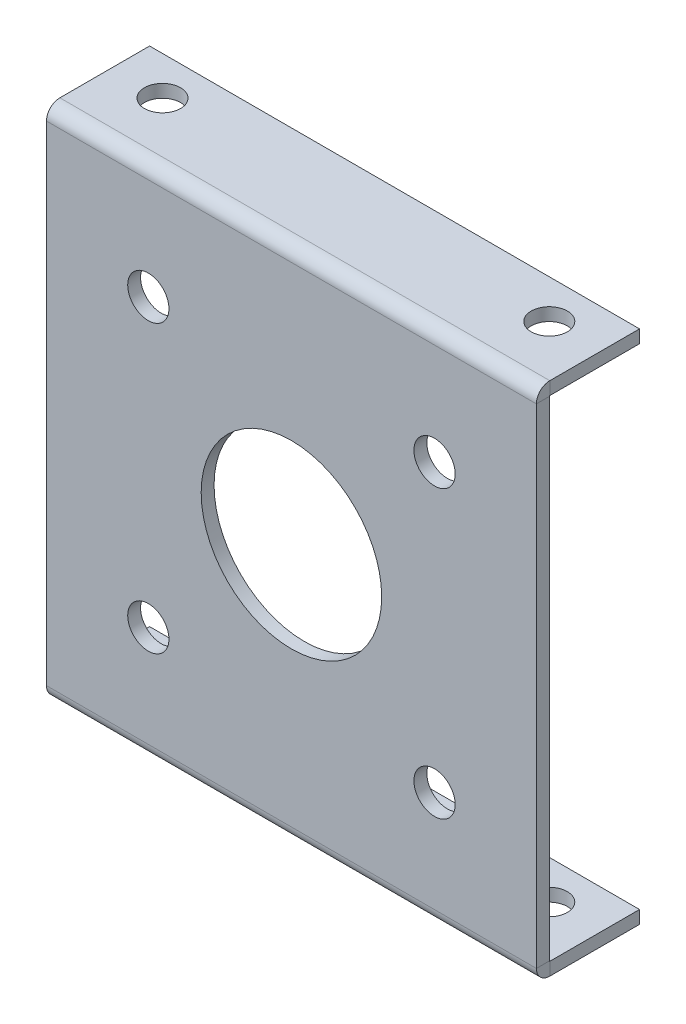
ISO-10303-21;
HEADER;
FILE_DESCRIPTION(('STEP AP214'),'2;1');
FILE_NAME('part.step','',(''),(''),'','','');
FILE_SCHEMA(('AUTOMOTIVE_DESIGN { 1 0 10303 214 1 1 1 1 }'));
ENDSEC;
DATA;
#1=APPLICATION_CONTEXT('core data for automotive mechanical design processes');
#2=APPLICATION_PROTOCOL_DEFINITION('international standard','automotive_design',2000,#1);
#3=PRODUCT_CONTEXT('',#1,'mechanical');
#4=PRODUCT('Part','Part','',(#3));
#5=PRODUCT_RELATED_PRODUCT_CATEGORY('part','',(#4));
#6=PRODUCT_DEFINITION_FORMATION('','',#4);
#7=PRODUCT_DEFINITION_CONTEXT('part definition',#1,'design');
#8=PRODUCT_DEFINITION('design','',#6,#7);
#9=PRODUCT_DEFINITION_SHAPE('','',#8);
#10=(LENGTH_UNIT() NAMED_UNIT(*) SI_UNIT(.MILLI.,.METRE.));
#11=(NAMED_UNIT(*) PLANE_ANGLE_UNIT() SI_UNIT($,.RADIAN.));
#12=(NAMED_UNIT(*) SI_UNIT($,.STERADIAN.) SOLID_ANGLE_UNIT());
#13=UNCERTAINTY_MEASURE_WITH_UNIT(LENGTH_MEASURE(1.E-05),#10,'distance_accuracy_value','');
#14=(GEOMETRIC_REPRESENTATION_CONTEXT(3) GLOBAL_UNCERTAINTY_ASSIGNED_CONTEXT((#13)) GLOBAL_UNIT_ASSIGNED_CONTEXT((#10,
#11,#12)) REPRESENTATION_CONTEXT('',''));
#15=CARTESIAN_POINT('',(0.,0.,0.));
#16=DIRECTION('',(0.,0.,1.));
#17=DIRECTION('',(1.,0.,0.));
#18=AXIS2_PLACEMENT_3D('',#15,#16,#17);
#19=CARTESIAN_POINT('',(0.,0.,-5.));
#20=DIRECTION('',(0.,0.,-1.));
#21=DIRECTION('',(-1.,0.,0.));
#22=AXIS2_PLACEMENT_3D('',#19,#20,#21);
#23=PLANE('',#22);
#24=CARTESIAN_POINT('',(55.5,-55.5,-5.));
#25=DIRECTION('',(0.,0.,-1.));
#26=DIRECTION('',(-1.,0.,0.));
#27=AXIS2_PLACEMENT_3D('',#24,#25,#26);
#28=CIRCLE('',#27,8.00000000000001);
#29=CARTESIAN_POINT('',(47.5,-55.5,-5.));
#30=VERTEX_POINT('',#29);
#31=EDGE_CURVE('E296',#30,#30,#28,.T.);
#32=ORIENTED_EDGE('',*,*,#31,.F.);
#33=EDGE_LOOP('',(#32));
#34=FACE_BOUND('',#33,.T.);
#35=CARTESIAN_POINT('',(-55.5,-55.5,-5.));
#36=DIRECTION('',(0.,0.,-1.));
#37=DIRECTION('',(-1.,0.,0.));
#38=AXIS2_PLACEMENT_3D('',#35,#36,#37);
#39=CIRCLE('',#38,8.);
#40=CARTESIAN_POINT('',(-63.5,-55.5,-5.));
#41=VERTEX_POINT('',#40);
#42=EDGE_CURVE('E309',#41,#41,#39,.T.);
#43=ORIENTED_EDGE('',*,*,#42,.F.);
#44=EDGE_LOOP('',(#43));
#45=FACE_BOUND('',#44,.T.);
#46=CARTESIAN_POINT('',(-55.5,55.5,-5.));
#47=DIRECTION('',(0.,0.,-1.));
#48=DIRECTION('',(-1.,0.,0.));
#49=AXIS2_PLACEMENT_3D('',#46,#47,#48);
#50=CIRCLE('',#49,8.);
#51=CARTESIAN_POINT('',(-63.5,55.5,-5.));
#52=VERTEX_POINT('',#51);
#53=EDGE_CURVE('E305',#52,#52,#50,.T.);
#54=ORIENTED_EDGE('',*,*,#53,.F.);
#55=EDGE_LOOP('',(#54));
#56=FACE_BOUND('',#55,.T.);
#57=CARTESIAN_POINT('',(55.5,55.5,-5.));
#58=DIRECTION('',(0.,0.,-1.));
#59=DIRECTION('',(-1.,0.,0.));
#60=AXIS2_PLACEMENT_3D('',#57,#58,#59);
#61=CIRCLE('',#60,8.00000000000001);
#62=CARTESIAN_POINT('',(47.5,55.5,-5.));
#63=VERTEX_POINT('',#62);
#64=EDGE_CURVE('E300',#63,#63,#61,.T.);
#65=ORIENTED_EDGE('',*,*,#64,.F.);
#66=EDGE_LOOP('',(#65));
#67=FACE_BOUND('',#66,.T.);
#68=CARTESIAN_POINT('',(0.,0.,-5.));
#69=DIRECTION('',(0.,0.,-1.));
#70=DIRECTION('',(-1.,0.,0.));
#71=AXIS2_PLACEMENT_3D('',#68,#69,#70);
#72=CIRCLE('',#71,35.);
#73=CARTESIAN_POINT('',(-35.,0.,-5.));
#74=VERTEX_POINT('',#73);
#75=EDGE_CURVE('E212',#74,#74,#72,.T.);
#76=ORIENTED_EDGE('',*,*,#75,.F.);
#77=EDGE_LOOP('',(#76));
#78=FACE_BOUND('',#77,.T.);
#79=DIRECTION('',(0.,1.,0.));
#80=VECTOR('',#79,1.);
#81=CARTESIAN_POINT('',(95.,-100.,-5.));
#82=LINE('',#81,#80);
#83=CARTESIAN_POINT('',(95.,-94.8,-5.00000000000001));
#84=VERTEX_POINT('',#83);
#85=CARTESIAN_POINT('',(95.,94.8,-5.));
#86=VERTEX_POINT('',#85);
#87=EDGE_CURVE('E87',#84,#86,#82,.T.);
#88=ORIENTED_EDGE('',*,*,#87,.F.);
#89=DIRECTION('',(-1.,0.,0.));
#90=VECTOR('',#89,1.);
#91=CARTESIAN_POINT('',(-95.,-94.8,-5.00000000000001));
#92=LINE('',#91,#90);
#93=CARTESIAN_POINT('',(-95.,-94.8,-5.00000000000001));
#94=VERTEX_POINT('',#93);
#95=EDGE_CURVE('E225',#94,#84,#92,.F.);
#96=ORIENTED_EDGE('',*,*,#95,.F.);
#97=DIRECTION('',(0.,-1.,0.));
#98=VECTOR('',#97,1.);
#99=CARTESIAN_POINT('',(-95.,-100.,-5.));
#100=LINE('',#99,#98);
#101=CARTESIAN_POINT('',(-95.,94.8,-5.));
#102=VERTEX_POINT('',#101);
#103=EDGE_CURVE('E13',#102,#94,#100,.T.);
#104=ORIENTED_EDGE('',*,*,#103,.F.);
#105=DIRECTION('',(1.,0.,0.));
#106=VECTOR('',#105,1.);
#107=CARTESIAN_POINT('',(95.,94.8,-5.00000000000001));
#108=LINE('',#107,#106);
#109=EDGE_CURVE('E281',#86,#102,#108,.F.);
#110=ORIENTED_EDGE('',*,*,#109,.F.);
#111=EDGE_LOOP('',(#88,#96,#104,#110));
#112=FACE_BOUND('',#111,.T.);
#113=ADVANCED_FACE('F78',(#34,#45,#56,#67,#78,#112),#23,.T.);
#114=CARTESIAN_POINT('',(0.,0.,0.));
#115=DIRECTION('',(0.,0.,-1.));
#116=DIRECTION('',(-1.,0.,0.));
#117=AXIS2_PLACEMENT_3D('',#114,#115,#116);
#118=PLANE('',#117);
#119=CARTESIAN_POINT('',(55.5,-55.5,0.));
#120=DIRECTION('',(0.,0.,-1.));
#121=DIRECTION('',(-1.,0.,0.));
#122=AXIS2_PLACEMENT_3D('',#119,#120,#121);
#123=CIRCLE('',#122,8.00000000000001);
#124=CARTESIAN_POINT('',(47.5,-55.5,0.));
#125=VERTEX_POINT('',#124);
#126=EDGE_CURVE('E310',#125,#125,#123,.T.);
#127=ORIENTED_EDGE('',*,*,#126,.T.);
#128=EDGE_LOOP('',(#127));
#129=FACE_BOUND('',#128,.T.);
#130=CARTESIAN_POINT('',(-55.5,-55.5,0.));
#131=DIRECTION('',(0.,0.,-1.));
#132=DIRECTION('',(-1.,0.,0.));
#133=AXIS2_PLACEMENT_3D('',#130,#131,#132);
#134=CIRCLE('',#133,8.);
#135=CARTESIAN_POINT('',(-63.5,-55.5,0.));
#136=VERTEX_POINT('',#135);
#137=EDGE_CURVE('E306',#136,#136,#134,.T.);
#138=ORIENTED_EDGE('',*,*,#137,.T.);
#139=EDGE_LOOP('',(#138));
#140=FACE_BOUND('',#139,.T.);
#141=CARTESIAN_POINT('',(-55.5,55.5,0.));
#142=DIRECTION('',(0.,0.,-1.));
#143=DIRECTION('',(-1.,0.,0.));
#144=AXIS2_PLACEMENT_3D('',#141,#142,#143);
#145=CIRCLE('',#144,8.);
#146=CARTESIAN_POINT('',(-63.5,55.5,0.));
#147=VERTEX_POINT('',#146);
#148=EDGE_CURVE('E302',#147,#147,#145,.T.);
#149=ORIENTED_EDGE('',*,*,#148,.T.);
#150=EDGE_LOOP('',(#149));
#151=FACE_BOUND('',#150,.T.);
#152=CARTESIAN_POINT('',(55.5,55.5,0.));
#153=DIRECTION('',(0.,0.,-1.));
#154=DIRECTION('',(-1.,0.,0.));
#155=AXIS2_PLACEMENT_3D('',#152,#153,#154);
#156=CIRCLE('',#155,8.00000000000001);
#157=CARTESIAN_POINT('',(47.5,55.5,0.));
#158=VERTEX_POINT('',#157);
#159=EDGE_CURVE('E297',#158,#158,#156,.T.);
#160=ORIENTED_EDGE('',*,*,#159,.T.);
#161=EDGE_LOOP('',(#160));
#162=FACE_BOUND('',#161,.T.);
#163=CARTESIAN_POINT('',(0.,0.,0.));
#164=DIRECTION('',(0.,0.,-1.));
#165=DIRECTION('',(-1.,0.,0.));
#166=AXIS2_PLACEMENT_3D('',#163,#164,#165);
#167=CIRCLE('',#166,35.);
#168=CARTESIAN_POINT('',(-35.,0.,0.));
#169=VERTEX_POINT('',#168);
#170=EDGE_CURVE('E293',#169,#169,#167,.T.);
#171=ORIENTED_EDGE('',*,*,#170,.T.);
#172=EDGE_LOOP('',(#171));
#173=FACE_BOUND('',#172,.T.);
#174=DIRECTION('',(-1.,0.,0.));
#175=VECTOR('',#174,1.);
#176=CARTESIAN_POINT('',(-95.,-94.8,0.));
#177=LINE('',#176,#175);
#178=CARTESIAN_POINT('',(-95.,-94.8,0.));
#179=VERTEX_POINT('',#178);
#180=CARTESIAN_POINT('',(95.,-94.8,0.));
#181=VERTEX_POINT('',#180);
#182=EDGE_CURVE('E213',#179,#181,#177,.F.);
#183=ORIENTED_EDGE('',*,*,#182,.T.);
#184=DIRECTION('',(0.,1.,0.));
#185=VECTOR('',#184,1.);
#186=CARTESIAN_POINT('',(95.,-100.,0.));
#187=LINE('',#186,#185);
#188=CARTESIAN_POINT('',(95.,94.8,0.));
#189=VERTEX_POINT('',#188);
#190=EDGE_CURVE('E287',#181,#189,#187,.T.);
#191=ORIENTED_EDGE('',*,*,#190,.T.);
#192=DIRECTION('',(1.,0.,0.));
#193=VECTOR('',#192,1.);
#194=CARTESIAN_POINT('',(95.,94.8,0.));
#195=LINE('',#194,#193);
#196=CARTESIAN_POINT('',(-95.,94.8,0.));
#197=VERTEX_POINT('',#196);
#198=EDGE_CURVE('E269',#189,#197,#195,.F.);
#199=ORIENTED_EDGE('',*,*,#198,.T.);
#200=DIRECTION('',(0.,-1.,0.));
#201=VECTOR('',#200,1.);
#202=CARTESIAN_POINT('',(-95.,-100.,0.));
#203=LINE('',#202,#201);
#204=EDGE_CURVE('E289',#197,#179,#203,.T.);
#205=ORIENTED_EDGE('',*,*,#204,.T.);
#206=EDGE_LOOP('',(#183,#191,#199,#205));
#207=FACE_BOUND('',#206,.T.);
#208=ADVANCED_FACE('F371',(#129,#140,#151,#162,#173,#207),#118,.F.);
#209=CARTESIAN_POINT('',(-95.,-100.,-5.));
#210=DIRECTION('',(-1.,0.,0.));
#211=DIRECTION('',(0.,0.,1.));
#212=AXIS2_PLACEMENT_3D('',#209,#210,#211);
#213=PLANE('',#212);
#214=ORIENTED_EDGE('',*,*,#103,.T.);
#215=DIRECTION('',(0.,0.,1.));
#216=VECTOR('',#215,1.);
#217=CARTESIAN_POINT('',(-95.,-94.8,-5.00000000000001));
#218=LINE('',#217,#216);
#219=EDGE_CURVE('E219',#94,#179,#218,.T.);
#220=ORIENTED_EDGE('',*,*,#219,.T.);
#221=ORIENTED_EDGE('',*,*,#204,.F.);
#222=DIRECTION('',(0.,0.,1.));
#223=VECTOR('',#222,1.);
#224=CARTESIAN_POINT('',(-95.,94.8,-5.00000000000001));
#225=LINE('',#224,#223);
#226=EDGE_CURVE('E94',#102,#197,#225,.T.);
#227=ORIENTED_EDGE('',*,*,#226,.F.);
#228=EDGE_LOOP('',(#214,#220,#221,#227));
#229=FACE_BOUND('',#228,.T.);
#230=ADVANCED_FACE('F377',(#229),#213,.T.);
#231=CARTESIAN_POINT('',(95.,-100.,-5.));
#232=DIRECTION('',(1.,0.,0.));
#233=DIRECTION('',(0.,0.,-1.));
#234=AXIS2_PLACEMENT_3D('',#231,#232,#233);
#235=PLANE('',#234);
#236=DIRECTION('',(0.,0.,1.));
#237=VECTOR('',#236,1.);
#238=CARTESIAN_POINT('',(95.,-94.8,-5.00000000000001));
#239=LINE('',#238,#237);
#240=EDGE_CURVE('E231',#84,#181,#239,.T.);
#241=ORIENTED_EDGE('',*,*,#240,.F.);
#242=ORIENTED_EDGE('',*,*,#87,.T.);
#243=DIRECTION('',(0.,0.,1.));
#244=VECTOR('',#243,1.);
#245=CARTESIAN_POINT('',(95.,94.8,-5.00000000000001));
#246=LINE('',#245,#244);
#247=EDGE_CURVE('E275',#86,#189,#246,.T.);
#248=ORIENTED_EDGE('',*,*,#247,.T.);
#249=ORIENTED_EDGE('',*,*,#190,.F.);
#250=EDGE_LOOP('',(#241,#242,#248,#249));
#251=FACE_BOUND('',#250,.T.);
#252=ADVANCED_FACE('F80',(#251),#235,.T.);
#253=CARTESIAN_POINT('',(-95.,94.8,-5.20000000000001));
#254=DIRECTION('',(-1.,0.,0.));
#255=DIRECTION('',(0.,0.,1.));
#256=AXIS2_PLACEMENT_3D('',#253,#254,#255);
#257=PLANE('',#256);
#258=DIRECTION('',(0.,1.,0.));
#259=VECTOR('',#258,1.);
#260=CARTESIAN_POINT('',(-95.,100.,-5.19999999999999));
#261=LINE('',#260,#259);
#262=CARTESIAN_POINT('',(-95.,95.,-5.20000000000001));
#263=VERTEX_POINT('',#262);
#264=CARTESIAN_POINT('',(-95.,100.,-5.19999999999999));
#265=VERTEX_POINT('',#264);
#266=EDGE_CURVE('E234',#263,#265,#261,.T.);
#267=ORIENTED_EDGE('',*,*,#266,.F.);
#268=CARTESIAN_POINT('',(-95.,94.8,-5.20000000000001));
#269=DIRECTION('',(1.,0.,0.));
#270=DIRECTION('',(0.,0.,-1.));
#271=AXIS2_PLACEMENT_3D('',#268,#269,#270);
#272=CIRCLE('',#271,0.200000000000006);
#273=EDGE_CURVE('E278',#102,#263,#272,.F.);
#274=ORIENTED_EDGE('',*,*,#273,.F.);
#275=ORIENTED_EDGE('',*,*,#226,.T.);
#276=CARTESIAN_POINT('',(-95.,94.8,-5.20000000000001));
#277=DIRECTION('',(1.,0.,0.));
#278=DIRECTION('',(0.,0.,-1.));
#279=AXIS2_PLACEMENT_3D('',#276,#277,#278);
#280=CIRCLE('',#279,5.20000000000001);
#281=EDGE_CURVE('E271',#197,#265,#280,.F.);
#282=ORIENTED_EDGE('',*,*,#281,.T.);
#283=EDGE_LOOP('',(#267,#274,#275,#282));
#284=FACE_BOUND('',#283,.T.);
#285=ADVANCED_FACE('F389',(#284),#257,.T.);
#286=CARTESIAN_POINT('',(95.,94.8,-5.20000000000001));
#287=DIRECTION('',(-1.,0.,0.));
#288=DIRECTION('',(0.,0.,1.));
#289=AXIS2_PLACEMENT_3D('',#286,#287,#288);
#290=PLANE('',#289);
#291=CARTESIAN_POINT('',(95.,94.8,-5.20000000000001));
#292=DIRECTION('',(1.,0.,0.));
#293=DIRECTION('',(0.,0.,-1.));
#294=AXIS2_PLACEMENT_3D('',#291,#292,#293);
#295=CIRCLE('',#294,0.200000000000006);
#296=CARTESIAN_POINT('',(95.,95.,-5.20000000000001));
#297=VERTEX_POINT('',#296);
#298=EDGE_CURVE('E239',#297,#86,#295,.T.);
#299=ORIENTED_EDGE('',*,*,#298,.F.);
#300=DIRECTION('',(0.,1.,0.));
#301=VECTOR('',#300,1.);
#302=CARTESIAN_POINT('',(95.,95.,-5.20000000000001));
#303=LINE('',#302,#301);
#304=CARTESIAN_POINT('',(95.,100.,-5.19999999999999));
#305=VERTEX_POINT('',#304);
#306=EDGE_CURVE('E262',#297,#305,#303,.T.);
#307=ORIENTED_EDGE('',*,*,#306,.T.);
#308=CARTESIAN_POINT('',(95.,94.8,-5.20000000000001));
#309=DIRECTION('',(1.,0.,0.));
#310=DIRECTION('',(0.,0.,-1.));
#311=AXIS2_PLACEMENT_3D('',#308,#309,#310);
#312=CIRCLE('',#311,5.20000000000001);
#313=EDGE_CURVE('E272',#305,#189,#312,.T.);
#314=ORIENTED_EDGE('',*,*,#313,.T.);
#315=ORIENTED_EDGE('',*,*,#247,.F.);
#316=EDGE_LOOP('',(#299,#307,#314,#315));
#317=FACE_BOUND('',#316,.T.);
#318=ADVANCED_FACE('F383',(#317),#290,.F.);
#319=CARTESIAN_POINT('',(95.,94.8,-5.20000000000001));
#320=DIRECTION('',(1.,0.,0.));
#321=DIRECTION('',(0.,1.,0.));
#322=AXIS2_PLACEMENT_3D('',#319,#320,#321);
#323=CYLINDRICAL_SURFACE('',#322,5.20000000000001);
#324=ORIENTED_EDGE('',*,*,#198,.F.);
#325=ORIENTED_EDGE('',*,*,#313,.F.);
#326=DIRECTION('',(1.,0.,0.));
#327=VECTOR('',#326,1.);
#328=CARTESIAN_POINT('',(0.,100.,-5.19999999999999));
#329=LINE('',#328,#327);
#330=EDGE_CURVE('E259',#265,#305,#329,.T.);
#331=ORIENTED_EDGE('',*,*,#330,.F.);
#332=ORIENTED_EDGE('',*,*,#281,.F.);
#333=EDGE_LOOP('',(#324,#325,#331,#332));
#334=FACE_BOUND('',#333,.T.);
#335=ADVANCED_FACE('F422',(#334),#323,.T.);
#336=CARTESIAN_POINT('',(95.,94.8,-5.20000000000001));
#337=DIRECTION('',(1.,0.,0.));
#338=DIRECTION('',(0.,1.,0.));
#339=AXIS2_PLACEMENT_3D('',#336,#337,#338);
#340=CYLINDRICAL_SURFACE('',#339,0.200000000000006);
#341=ORIENTED_EDGE('',*,*,#109,.T.);
#342=ORIENTED_EDGE('',*,*,#273,.T.);
#343=DIRECTION('',(-1.,0.,0.));
#344=VECTOR('',#343,1.);
#345=CARTESIAN_POINT('',(-95.,95.,-5.20000000000001));
#346=LINE('',#345,#344);
#347=EDGE_CURVE('E265',#263,#297,#346,.F.);
#348=ORIENTED_EDGE('',*,*,#347,.T.);
#349=ORIENTED_EDGE('',*,*,#298,.T.);
#350=EDGE_LOOP('',(#341,#342,#348,#349));
#351=FACE_BOUND('',#350,.T.);
#352=ADVANCED_FACE('F395',(#351),#340,.F.);
#353=CARTESIAN_POINT('',(95.,100.,-4.99999999999998));
#354=DIRECTION('',(1.,0.,0.));
#355=DIRECTION('',(0.,0.,-1.));
#356=AXIS2_PLACEMENT_3D('',#353,#354,#355);
#357=PLANE('',#356);
#358=DIRECTION('',(0.,0.,1.));
#359=VECTOR('',#358,1.);
#360=CARTESIAN_POINT('',(95.,100.,-4.99999999999998));
#361=LINE('',#360,#359);
#362=CARTESIAN_POINT('',(95.,100.,-40.));
#363=VERTEX_POINT('',#362);
#364=EDGE_CURVE('E243',#363,#305,#361,.T.);
#365=ORIENTED_EDGE('',*,*,#364,.T.);
#366=ORIENTED_EDGE('',*,*,#306,.F.);
#367=DIRECTION('',(0.,0.,-1.));
#368=VECTOR('',#367,1.);
#369=CARTESIAN_POINT('',(95.,95.,3.56857400772372E-13));
#370=LINE('',#369,#368);
#371=CARTESIAN_POINT('',(95.,95.0000000000001,-40.));
#372=VERTEX_POINT('',#371);
#373=EDGE_CURVE('E251',#372,#297,#370,.F.);
#374=ORIENTED_EDGE('',*,*,#373,.F.);
#375=DIRECTION('',(0.,-1.,0.));
#376=VECTOR('',#375,1.);
#377=CARTESIAN_POINT('',(95.,100.,-40.));
#378=LINE('',#377,#376);
#379=EDGE_CURVE('E237',#363,#372,#378,.T.);
#380=ORIENTED_EDGE('',*,*,#379,.F.);
#381=EDGE_LOOP('',(#365,#366,#374,#380));
#382=FACE_BOUND('',#381,.T.);
#383=ADVANCED_FACE('F417',(#382),#357,.T.);
#384=CARTESIAN_POINT('',(-95.,100.,-40.));
#385=DIRECTION('',(-1.,0.,0.));
#386=DIRECTION('',(0.,0.,1.));
#387=AXIS2_PLACEMENT_3D('',#384,#385,#386);
#388=PLANE('',#387);
#389=DIRECTION('',(0.,0.,1.));
#390=VECTOR('',#389,1.);
#391=CARTESIAN_POINT('',(-95.,95.,3.56857400772372E-13));
#392=LINE('',#391,#390);
#393=CARTESIAN_POINT('',(-95.,95.0000000000001,-40.));
#394=VERTEX_POINT('',#393);
#395=EDGE_CURVE('E257',#263,#394,#392,.F.);
#396=ORIENTED_EDGE('',*,*,#395,.F.);
#397=ORIENTED_EDGE('',*,*,#266,.T.);
#398=DIRECTION('',(0.,0.,-1.));
#399=VECTOR('',#398,1.);
#400=CARTESIAN_POINT('',(-95.,100.,-40.));
#401=LINE('',#400,#399);
#402=CARTESIAN_POINT('',(-95.,100.,-40.));
#403=VERTEX_POINT('',#402);
#404=EDGE_CURVE('E249',#265,#403,#401,.T.);
#405=ORIENTED_EDGE('',*,*,#404,.T.);
#406=DIRECTION('',(0.,-1.,0.));
#407=VECTOR('',#406,1.);
#408=CARTESIAN_POINT('',(-95.,100.,-40.));
#409=LINE('',#408,#407);
#410=EDGE_CURVE('E240',#403,#394,#409,.T.);
#411=ORIENTED_EDGE('',*,*,#410,.T.);
#412=EDGE_LOOP('',(#396,#397,#405,#411));
#413=FACE_BOUND('',#412,.T.);
#414=ADVANCED_FACE('F403',(#413),#388,.T.);
#415=CARTESIAN_POINT('',(0.,100.,3.74314807466587E-13));
#416=DIRECTION('',(0.,1.,0.));
#417=DIRECTION('',(0.,0.,1.));
#418=AXIS2_PLACEMENT_3D('',#415,#416,#417);
#419=PLANE('',#418);
#420=CARTESIAN_POINT('',(-75.,100.,-25.0000000000007));
#421=DIRECTION('',(0.,-1.,0.));
#422=DIRECTION('',(0.,0.,-1.));
#423=AXIS2_PLACEMENT_3D('',#420,#421,#422);
#424=CIRCLE('',#423,7.);
#425=CARTESIAN_POINT('',(-75.,100.,-32.0000000000007));
#426=VERTEX_POINT('',#425);
#427=EDGE_CURVE('E315',#426,#426,#424,.T.);
#428=ORIENTED_EDGE('',*,*,#427,.T.);
#429=EDGE_LOOP('',(#428));
#430=FACE_BOUND('',#429,.T.);
#431=CARTESIAN_POINT('',(75.,100.,-25.0000000000007));
#432=DIRECTION('',(0.,-1.,0.));
#433=DIRECTION('',(0.,0.,-1.));
#434=AXIS2_PLACEMENT_3D('',#431,#432,#433);
#435=CIRCLE('',#434,7.);
#436=CARTESIAN_POINT('',(75.,100.,-32.0000000000007));
#437=VERTEX_POINT('',#436);
#438=EDGE_CURVE('E322',#437,#437,#435,.T.);
#439=ORIENTED_EDGE('',*,*,#438,.T.);
#440=EDGE_LOOP('',(#439));
#441=FACE_BOUND('',#440,.T.);
#442=ORIENTED_EDGE('',*,*,#404,.F.);
#443=ORIENTED_EDGE('',*,*,#330,.T.);
#444=ORIENTED_EDGE('',*,*,#364,.F.);
#445=DIRECTION('',(1.,0.,0.));
#446=VECTOR('',#445,1.);
#447=CARTESIAN_POINT('',(95.,100.,-40.));
#448=LINE('',#447,#446);
#449=EDGE_CURVE('E246',#403,#363,#448,.T.);
#450=ORIENTED_EDGE('',*,*,#449,.F.);
#451=EDGE_LOOP('',(#442,#443,#444,#450));
#452=FACE_BOUND('',#451,.T.);
#453=ADVANCED_FACE('F407',(#430,#441,#452),#419,.T.);
#454=CARTESIAN_POINT('',(0.,95.,3.56857400772372E-13));
#455=DIRECTION('',(0.,1.,0.));
#456=DIRECTION('',(0.,0.,1.));
#457=AXIS2_PLACEMENT_3D('',#454,#455,#456);
#458=PLANE('',#457);
#459=CARTESIAN_POINT('',(-75.,95.0000000000001,-25.0000000000007));
#460=DIRECTION('',(0.,1.,0.));
#461=DIRECTION('',(0.,0.,1.));
#462=AXIS2_PLACEMENT_3D('',#459,#460,#461);
#463=CIRCLE('',#462,7.);
#464=CARTESIAN_POINT('',(-75.,95.,-18.0000000000007));
#465=VERTEX_POINT('',#464);
#466=EDGE_CURVE('E301',#465,#465,#463,.T.);
#467=ORIENTED_EDGE('',*,*,#466,.T.);
#468=EDGE_LOOP('',(#467));
#469=FACE_BOUND('',#468,.T.);
#470=CARTESIAN_POINT('',(75.,95.0000000000001,-25.0000000000007));
#471=DIRECTION('',(0.,1.,0.));
#472=DIRECTION('',(0.,0.,1.));
#473=AXIS2_PLACEMENT_3D('',#470,#471,#472);
#474=CIRCLE('',#473,7.);
#475=CARTESIAN_POINT('',(75.,95.,-18.0000000000007));
#476=VERTEX_POINT('',#475);
#477=EDGE_CURVE('E319',#476,#476,#474,.T.);
#478=ORIENTED_EDGE('',*,*,#477,.T.);
#479=EDGE_LOOP('',(#478));
#480=FACE_BOUND('',#479,.T.);
#481=ORIENTED_EDGE('',*,*,#347,.F.);
#482=ORIENTED_EDGE('',*,*,#395,.T.);
#483=DIRECTION('',(-1.,0.,0.));
#484=VECTOR('',#483,1.);
#485=CARTESIAN_POINT('',(0.,95.0000000000001,-40.));
#486=LINE('',#485,#484);
#487=EDGE_CURVE('E254',#394,#372,#486,.F.);
#488=ORIENTED_EDGE('',*,*,#487,.T.);
#489=ORIENTED_EDGE('',*,*,#373,.T.);
#490=EDGE_LOOP('',(#481,#482,#488,#489));
#491=FACE_BOUND('',#490,.T.);
#492=ADVANCED_FACE('F414',(#469,#480,#491),#458,.F.);
#493=CARTESIAN_POINT('',(95.,100.,-40.));
#494=DIRECTION('',(0.,0.,-1.));
#495=DIRECTION('',(0.,1.,0.));
#496=AXIS2_PLACEMENT_3D('',#493,#494,#495);
#497=PLANE('',#496);
#498=ORIENTED_EDGE('',*,*,#487,.F.);
#499=ORIENTED_EDGE('',*,*,#410,.F.);
#500=ORIENTED_EDGE('',*,*,#449,.T.);
#501=ORIENTED_EDGE('',*,*,#379,.T.);
#502=EDGE_LOOP('',(#498,#499,#500,#501));
#503=FACE_BOUND('',#502,.T.);
#504=ADVANCED_FACE('F411',(#503),#497,.T.);
#505=CARTESIAN_POINT('',(95.,-94.8,-5.20000000000001));
#506=DIRECTION('',(1.,0.,0.));
#507=DIRECTION('',(0.,0.,-1.));
#508=AXIS2_PLACEMENT_3D('',#505,#506,#507);
#509=PLANE('',#508);
#510=DIRECTION('',(0.,1.,0.));
#511=VECTOR('',#510,1.);
#512=CARTESIAN_POINT('',(95.,-100.,-5.19999999999999));
#513=LINE('',#512,#511);
#514=CARTESIAN_POINT('',(95.,-95.,-5.20000000000001));
#515=VERTEX_POINT('',#514);
#516=CARTESIAN_POINT('',(95.,-100.,-5.19999999999999));
#517=VERTEX_POINT('',#516);
#518=EDGE_CURVE('E194',#515,#517,#513,.F.);
#519=ORIENTED_EDGE('',*,*,#518,.F.);
#520=CARTESIAN_POINT('',(95.,-94.8,-5.20000000000001));
#521=DIRECTION('',(-1.,0.,0.));
#522=DIRECTION('',(0.,0.,1.));
#523=AXIS2_PLACEMENT_3D('',#520,#521,#522);
#524=CIRCLE('',#523,0.200000000000006);
#525=EDGE_CURVE('E222',#84,#515,#524,.F.);
#526=ORIENTED_EDGE('',*,*,#525,.F.);
#527=ORIENTED_EDGE('',*,*,#240,.T.);
#528=CARTESIAN_POINT('',(95.,-94.8,-5.20000000000001));
#529=DIRECTION('',(-1.,0.,0.));
#530=DIRECTION('',(0.,0.,1.));
#531=AXIS2_PLACEMENT_3D('',#528,#529,#530);
#532=CIRCLE('',#531,5.20000000000001);
#533=EDGE_CURVE('E215',#181,#517,#532,.F.);
#534=ORIENTED_EDGE('',*,*,#533,.T.);
#535=EDGE_LOOP('',(#519,#526,#527,#534));
#536=FACE_BOUND('',#535,.T.);
#537=ADVANCED_FACE('F427',(#536),#509,.T.);
#538=CARTESIAN_POINT('',(-95.,-94.8,-5.20000000000001));
#539=DIRECTION('',(1.,0.,0.));
#540=DIRECTION('',(0.,0.,-1.));
#541=AXIS2_PLACEMENT_3D('',#538,#539,#540);
#542=PLANE('',#541);
#543=CARTESIAN_POINT('',(-95.,-94.8,-5.20000000000001));
#544=DIRECTION('',(-1.,0.,0.));
#545=DIRECTION('',(0.,0.,1.));
#546=AXIS2_PLACEMENT_3D('',#543,#544,#545);
#547=CIRCLE('',#546,0.200000000000006);
#548=CARTESIAN_POINT('',(-95.,-95.,-5.20000000000001));
#549=VERTEX_POINT('',#548);
#550=EDGE_CURVE('E228',#549,#94,#547,.T.);
#551=ORIENTED_EDGE('',*,*,#550,.F.);
#552=DIRECTION('',(0.,1.,0.));
#553=VECTOR('',#552,1.);
#554=CARTESIAN_POINT('',(-95.,-95.,-5.20000000000001));
#555=LINE('',#554,#553);
#556=CARTESIAN_POINT('',(-95.,-100.,-5.19999999999999));
#557=VERTEX_POINT('',#556);
#558=EDGE_CURVE('E206',#549,#557,#555,.F.);
#559=ORIENTED_EDGE('',*,*,#558,.T.);
#560=CARTESIAN_POINT('',(-95.,-94.8,-5.20000000000001));
#561=DIRECTION('',(-1.,0.,0.));
#562=DIRECTION('',(0.,0.,1.));
#563=AXIS2_PLACEMENT_3D('',#560,#561,#562);
#564=CIRCLE('',#563,5.20000000000001);
#565=EDGE_CURVE('E216',#557,#179,#564,.T.);
#566=ORIENTED_EDGE('',*,*,#565,.T.);
#567=ORIENTED_EDGE('',*,*,#219,.F.);
#568=EDGE_LOOP('',(#551,#559,#566,#567));
#569=FACE_BOUND('',#568,.T.);
#570=ADVANCED_FACE('F357',(#569),#542,.F.);
#571=CARTESIAN_POINT('',(-95.,-94.8,-5.20000000000001));
#572=DIRECTION('',(-1.,0.,0.));
#573=DIRECTION('',(0.,-1.,0.));
#574=AXIS2_PLACEMENT_3D('',#571,#572,#573);
#575=CYLINDRICAL_SURFACE('',#574,5.20000000000001);
#576=ORIENTED_EDGE('',*,*,#182,.F.);
#577=ORIENTED_EDGE('',*,*,#565,.F.);
#578=DIRECTION('',(-1.,0.,0.));
#579=VECTOR('',#578,1.);
#580=CARTESIAN_POINT('',(95.,-100.,-5.19999999999999));
#581=LINE('',#580,#579);
#582=EDGE_CURVE('E204',#557,#517,#581,.F.);
#583=ORIENTED_EDGE('',*,*,#582,.T.);
#584=ORIENTED_EDGE('',*,*,#533,.F.);
#585=EDGE_LOOP('',(#576,#577,#583,#584));
#586=FACE_BOUND('',#585,.T.);
#587=ADVANCED_FACE('F366',(#586),#575,.T.);
#588=CARTESIAN_POINT('',(-95.,-94.8,-5.20000000000001));
#589=DIRECTION('',(-1.,0.,0.));
#590=DIRECTION('',(0.,-1.,0.));
#591=AXIS2_PLACEMENT_3D('',#588,#589,#590);
#592=CYLINDRICAL_SURFACE('',#591,0.200000000000006);
#593=ORIENTED_EDGE('',*,*,#95,.T.);
#594=ORIENTED_EDGE('',*,*,#525,.T.);
#595=DIRECTION('',(-1.,0.,0.));
#596=VECTOR('',#595,1.);
#597=CARTESIAN_POINT('',(95.,-95.,-5.20000000000001));
#598=LINE('',#597,#596);
#599=EDGE_CURVE('E209',#515,#549,#598,.T.);
#600=ORIENTED_EDGE('',*,*,#599,.T.);
#601=ORIENTED_EDGE('',*,*,#550,.T.);
#602=EDGE_LOOP('',(#593,#594,#600,#601));
#603=FACE_BOUND('',#602,.T.);
#604=ADVANCED_FACE('F352',(#603),#592,.F.);
#605=CARTESIAN_POINT('',(-95.,-100.,-40.));
#606=DIRECTION('',(1.,0.,0.));
#607=DIRECTION('',(0.,0.,-1.));
#608=AXIS2_PLACEMENT_3D('',#605,#606,#607);
#609=PLANE('',#608);
#610=ORIENTED_EDGE('',*,*,#558,.F.);
#611=DIRECTION('',(0.,0.,1.));
#612=VECTOR('',#611,1.);
#613=CARTESIAN_POINT('',(-95.,-95.0000000000001,-40.));
#614=LINE('',#613,#612);
#615=CARTESIAN_POINT('',(-95.,-95.0000000000001,-40.));
#616=VERTEX_POINT('',#615);
#617=EDGE_CURVE('E202',#549,#616,#614,.F.);
#618=ORIENTED_EDGE('',*,*,#617,.T.);
#619=DIRECTION('',(0.,1.,0.));
#620=VECTOR('',#619,1.);
#621=CARTESIAN_POINT('',(-95.,-100.,-40.));
#622=LINE('',#621,#620);
#623=CARTESIAN_POINT('',(-95.,-100.,-40.));
#624=VERTEX_POINT('',#623);
#625=EDGE_CURVE('E190',#624,#616,#622,.T.);
#626=ORIENTED_EDGE('',*,*,#625,.F.);
#627=DIRECTION('',(0.,0.,-1.));
#628=VECTOR('',#627,1.);
#629=CARTESIAN_POINT('',(-95.,-100.,3.74314807466587E-13));
#630=LINE('',#629,#628);
#631=EDGE_CURVE('E177',#557,#624,#630,.T.);
#632=ORIENTED_EDGE('',*,*,#631,.F.);
#633=EDGE_LOOP('',(#610,#618,#626,#632));
#634=FACE_BOUND('',#633,.T.);
#635=ADVANCED_FACE('F358',(#634),#609,.F.);
#636=CARTESIAN_POINT('',(95.,-100.,-4.99999999999998));
#637=DIRECTION('',(-1.,0.,0.));
#638=DIRECTION('',(0.,0.,1.));
#639=AXIS2_PLACEMENT_3D('',#636,#637,#638);
#640=PLANE('',#639);
#641=ORIENTED_EDGE('',*,*,#518,.T.);
#642=DIRECTION('',(0.,0.,1.));
#643=VECTOR('',#642,1.);
#644=CARTESIAN_POINT('',(95.,-100.,3.74314807466587E-13));
#645=LINE('',#644,#643);
#646=CARTESIAN_POINT('',(95.,-100.,-40.));
#647=VERTEX_POINT('',#646);
#648=EDGE_CURVE('E175',#647,#517,#645,.T.);
#649=ORIENTED_EDGE('',*,*,#648,.F.);
#650=DIRECTION('',(0.,1.,0.));
#651=VECTOR('',#650,1.);
#652=CARTESIAN_POINT('',(95.,-100.,-40.));
#653=LINE('',#652,#651);
#654=CARTESIAN_POINT('',(95.,-95.0000000000001,-40.));
#655=VERTEX_POINT('',#654);
#656=EDGE_CURVE('E183',#647,#655,#653,.T.);
#657=ORIENTED_EDGE('',*,*,#656,.T.);
#658=DIRECTION('',(0.,0.,-1.));
#659=VECTOR('',#658,1.);
#660=CARTESIAN_POINT('',(95.,-95.,-5.));
#661=LINE('',#660,#659);
#662=EDGE_CURVE('E199',#655,#515,#661,.F.);
#663=ORIENTED_EDGE('',*,*,#662,.T.);
#664=EDGE_LOOP('',(#641,#649,#657,#663));
#665=FACE_BOUND('',#664,.T.);
#666=ADVANCED_FACE('F193',(#665),#640,.F.);
#667=CARTESIAN_POINT('',(0.,-100.,3.74314807466587E-13));
#668=DIRECTION('',(0.,1.,0.));
#669=DIRECTION('',(0.,0.,1.));
#670=AXIS2_PLACEMENT_3D('',#667,#668,#669);
#671=PLANE('',#670);
#672=CARTESIAN_POINT('',(-75.,-100.,-25.));
#673=DIRECTION('',(0.,1.,0.));
#674=DIRECTION('',(0.,0.,1.));
#675=AXIS2_PLACEMENT_3D('',#672,#673,#674);
#676=CIRCLE('',#675,7.);
#677=CARTESIAN_POINT('',(-75.,-100.,-18.));
#678=VERTEX_POINT('',#677);
#679=EDGE_CURVE('E331',#678,#678,#676,.T.);
#680=ORIENTED_EDGE('',*,*,#679,.T.);
#681=EDGE_LOOP('',(#680));
#682=FACE_BOUND('',#681,.T.);
#683=CARTESIAN_POINT('',(75.,-100.,-25.));
#684=DIRECTION('',(0.,1.,0.));
#685=DIRECTION('',(0.,0.,1.));
#686=AXIS2_PLACEMENT_3D('',#683,#684,#685);
#687=CIRCLE('',#686,7.);
#688=CARTESIAN_POINT('',(75.,-100.,-18.));
#689=VERTEX_POINT('',#688);
#690=EDGE_CURVE('E314',#689,#689,#687,.T.);
#691=ORIENTED_EDGE('',*,*,#690,.T.);
#692=EDGE_LOOP('',(#691));
#693=FACE_BOUND('',#692,.T.);
#694=ORIENTED_EDGE('',*,*,#582,.F.);
#695=ORIENTED_EDGE('',*,*,#631,.T.);
#696=DIRECTION('',(1.,0.,0.));
#697=VECTOR('',#696,1.);
#698=CARTESIAN_POINT('',(0.,-100.,-40.));
#699=LINE('',#698,#697);
#700=EDGE_CURVE('E170',#624,#647,#699,.T.);
#701=ORIENTED_EDGE('',*,*,#700,.T.);
#702=ORIENTED_EDGE('',*,*,#648,.T.);
#703=EDGE_LOOP('',(#694,#695,#701,#702));
#704=FACE_BOUND('',#703,.T.);
#705=ADVANCED_FACE('F173',(#682,#693,#704),#671,.F.);
#706=CARTESIAN_POINT('',(0.,-95.,3.56857400772372E-13));
#707=DIRECTION('',(0.,1.,0.));
#708=DIRECTION('',(0.,0.,1.));
#709=AXIS2_PLACEMENT_3D('',#706,#707,#708);
#710=PLANE('',#709);
#711=CARTESIAN_POINT('',(-75.,-95.0000000000001,-25.));
#712=DIRECTION('',(0.,1.,0.));
#713=DIRECTION('',(0.,0.,1.));
#714=AXIS2_PLACEMENT_3D('',#711,#712,#713);
#715=CIRCLE('',#714,7.);
#716=CARTESIAN_POINT('',(-75.,-95.,-18.));
#717=VERTEX_POINT('',#716);
#718=EDGE_CURVE('E82',#717,#717,#715,.T.);
#719=ORIENTED_EDGE('',*,*,#718,.F.);
#720=EDGE_LOOP('',(#719));
#721=FACE_BOUND('',#720,.T.);
#722=CARTESIAN_POINT('',(75.,-95.0000000000001,-25.));
#723=DIRECTION('',(0.,1.,0.));
#724=DIRECTION('',(0.,0.,1.));
#725=AXIS2_PLACEMENT_3D('',#722,#723,#724);
#726=CIRCLE('',#725,7.);
#727=CARTESIAN_POINT('',(75.,-95.,-18.));
#728=VERTEX_POINT('',#727);
#729=EDGE_CURVE('E312',#728,#728,#726,.T.);
#730=ORIENTED_EDGE('',*,*,#729,.F.);
#731=EDGE_LOOP('',(#730));
#732=FACE_BOUND('',#731,.T.);
#733=ORIENTED_EDGE('',*,*,#617,.F.);
#734=ORIENTED_EDGE('',*,*,#599,.F.);
#735=ORIENTED_EDGE('',*,*,#662,.F.);
#736=DIRECTION('',(-1.,0.,0.));
#737=VECTOR('',#736,1.);
#738=CARTESIAN_POINT('',(95.,-95.0000000000001,-40.));
#739=LINE('',#738,#737);
#740=EDGE_CURVE('E186',#616,#655,#739,.F.);
#741=ORIENTED_EDGE('',*,*,#740,.F.);
#742=EDGE_LOOP('',(#733,#734,#735,#741));
#743=FACE_BOUND('',#742,.T.);
#744=ADVANCED_FACE('F348',(#721,#732,#743),#710,.T.);
#745=CARTESIAN_POINT('',(95.,-100.,-40.));
#746=DIRECTION('',(0.,0.,1.));
#747=DIRECTION('',(0.,-1.,0.));
#748=AXIS2_PLACEMENT_3D('',#745,#746,#747);
#749=PLANE('',#748);
#750=ORIENTED_EDGE('',*,*,#740,.T.);
#751=ORIENTED_EDGE('',*,*,#656,.F.);
#752=ORIENTED_EDGE('',*,*,#700,.F.);
#753=ORIENTED_EDGE('',*,*,#625,.T.);
#754=EDGE_LOOP('',(#750,#751,#752,#753));
#755=FACE_BOUND('',#754,.T.);
#756=ADVANCED_FACE('F184',(#755),#749,.F.);
#757=CARTESIAN_POINT('',(0.,0.,-40.));
#758=DIRECTION('',(0.,0.,1.));
#759=DIRECTION('',(1.,0.,0.));
#760=AXIS2_PLACEMENT_3D('',#757,#758,#759);
#761=CYLINDRICAL_SURFACE('',#760,35.);
#762=ORIENTED_EDGE('',*,*,#75,.T.);
#763=EDGE_LOOP('',(#762));
#764=FACE_BOUND('',#763,.T.);
#765=ORIENTED_EDGE('',*,*,#170,.F.);
#766=EDGE_LOOP('',(#765));
#767=FACE_BOUND('',#766,.T.);
#768=ADVANCED_FACE('F549',(#764,#767),#761,.F.);
#769=CARTESIAN_POINT('',(55.5,55.5,-40.));
#770=DIRECTION('',(0.,0.,1.));
#771=DIRECTION('',(1.,0.,0.));
#772=AXIS2_PLACEMENT_3D('',#769,#770,#771);
#773=CYLINDRICAL_SURFACE('',#772,8.00000000000001);
#774=ORIENTED_EDGE('',*,*,#64,.T.);
#775=EDGE_LOOP('',(#774));
#776=FACE_BOUND('',#775,.T.);
#777=ORIENTED_EDGE('',*,*,#159,.F.);
#778=EDGE_LOOP('',(#777));
#779=FACE_BOUND('',#778,.T.);
#780=ADVANCED_FACE('F559',(#776,#779),#773,.F.);
#781=CARTESIAN_POINT('',(-55.5,55.5,-40.));
#782=DIRECTION('',(0.,0.,1.));
#783=DIRECTION('',(1.,0.,0.));
#784=AXIS2_PLACEMENT_3D('',#781,#782,#783);
#785=CYLINDRICAL_SURFACE('',#784,8.);
#786=ORIENTED_EDGE('',*,*,#53,.T.);
#787=EDGE_LOOP('',(#786));
#788=FACE_BOUND('',#787,.T.);
#789=ORIENTED_EDGE('',*,*,#148,.F.);
#790=EDGE_LOOP('',(#789));
#791=FACE_BOUND('',#790,.T.);
#792=ADVANCED_FACE('F581',(#788,#791),#785,.F.);
#793=CARTESIAN_POINT('',(-55.5,-55.5,-40.));
#794=DIRECTION('',(0.,0.,1.));
#795=DIRECTION('',(1.,0.,0.));
#796=AXIS2_PLACEMENT_3D('',#793,#794,#795);
#797=CYLINDRICAL_SURFACE('',#796,8.);
#798=ORIENTED_EDGE('',*,*,#42,.T.);
#799=EDGE_LOOP('',(#798));
#800=FACE_BOUND('',#799,.T.);
#801=ORIENTED_EDGE('',*,*,#137,.F.);
#802=EDGE_LOOP('',(#801));
#803=FACE_BOUND('',#802,.T.);
#804=ADVANCED_FACE('F592',(#800,#803),#797,.F.);
#805=CARTESIAN_POINT('',(55.5,-55.5,-40.));
#806=DIRECTION('',(0.,0.,1.));
#807=DIRECTION('',(1.,0.,0.));
#808=AXIS2_PLACEMENT_3D('',#805,#806,#807);
#809=CYLINDRICAL_SURFACE('',#808,8.00000000000001);
#810=ORIENTED_EDGE('',*,*,#31,.T.);
#811=EDGE_LOOP('',(#810));
#812=FACE_BOUND('',#811,.T.);
#813=ORIENTED_EDGE('',*,*,#126,.F.);
#814=EDGE_LOOP('',(#813));
#815=FACE_BOUND('',#814,.T.);
#816=ADVANCED_FACE('F602',(#812,#815),#809,.F.);
#817=CARTESIAN_POINT('',(75.,100.,-25.0000000000007));
#818=DIRECTION('',(0.,-1.,0.));
#819=DIRECTION('',(0.,0.,-1.));
#820=AXIS2_PLACEMENT_3D('',#817,#818,#819);
#821=CYLINDRICAL_SURFACE('',#820,7.);
#822=ORIENTED_EDGE('',*,*,#729,.T.);
#823=EDGE_LOOP('',(#822));
#824=FACE_BOUND('',#823,.T.);
#825=ORIENTED_EDGE('',*,*,#690,.F.);
#826=EDGE_LOOP('',(#825));
#827=FACE_BOUND('',#826,.T.);
#828=ADVANCED_FACE('F612',(#824,#827),#821,.F.);
#829=CARTESIAN_POINT('',(-75.,100.,-25.0000000000007));
#830=DIRECTION('',(0.,-1.,0.));
#831=DIRECTION('',(0.,0.,-1.));
#832=AXIS2_PLACEMENT_3D('',#829,#830,#831);
#833=CYLINDRICAL_SURFACE('',#832,7.);
#834=ORIENTED_EDGE('',*,*,#718,.T.);
#835=EDGE_LOOP('',(#834));
#836=FACE_BOUND('',#835,.T.);
#837=ORIENTED_EDGE('',*,*,#679,.F.);
#838=EDGE_LOOP('',(#837));
#839=FACE_BOUND('',#838,.T.);
#840=ADVANCED_FACE('F624',(#836,#839),#833,.F.);
#841=ORIENTED_EDGE('',*,*,#438,.F.);
#842=EDGE_LOOP('',(#841));
#843=FACE_BOUND('',#842,.T.);
#844=ORIENTED_EDGE('',*,*,#477,.F.);
#845=EDGE_LOOP('',(#844));
#846=FACE_BOUND('',#845,.T.);
#847=ADVANCED_FACE('F626',(#843,#846),#821,.F.);
#848=ORIENTED_EDGE('',*,*,#427,.F.);
#849=EDGE_LOOP('',(#848));
#850=FACE_BOUND('',#849,.T.);
#851=ORIENTED_EDGE('',*,*,#466,.F.);
#852=EDGE_LOOP('',(#851));
#853=FACE_BOUND('',#852,.T.);
#854=ADVANCED_FACE('F634',(#850,#853),#833,.F.);
#855=CLOSED_SHELL('',(#113,#208,#230,#252,#285,#318,#335,#352,#383,#414,#453,#492,#504,#537,
#570,#587,#604,#635,#666,#705,#744,#756,#768,#780,#792,#804,#816,#828,#840,#847,#854));
#856=MANIFOLD_SOLID_BREP('B2',#855);
#857=ADVANCED_BREP_SHAPE_REPRESENTATION('',(#18,#856),#14);
#858=SHAPE_DEFINITION_REPRESENTATION(#9,#857);
ENDSEC;
END-ISO-10303-21;
